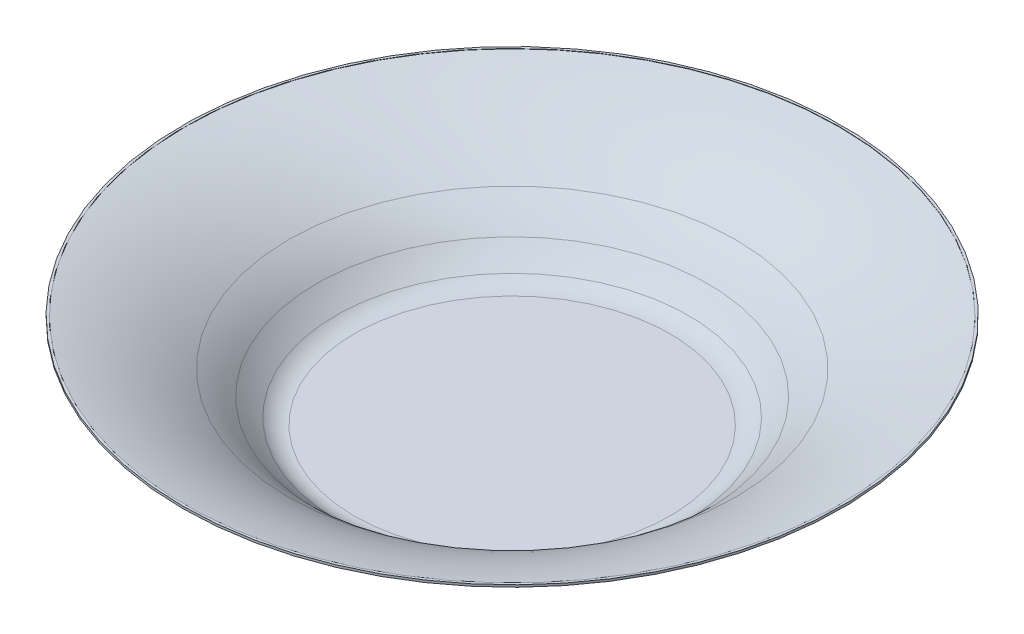
ISO-10303-21;
HEADER;
FILE_DESCRIPTION(('STEP AP214'),'2;1');
FILE_NAME('part.step','',(''),(''),'','','');
FILE_SCHEMA(('AUTOMOTIVE_DESIGN { 1 0 10303 214 1 1 1 1 }'));
ENDSEC;
DATA;
#1=APPLICATION_CONTEXT('core data for automotive mechanical design processes');
#2=APPLICATION_PROTOCOL_DEFINITION('international standard','automotive_design',2000,#1);
#3=PRODUCT_CONTEXT('',#1,'mechanical');
#4=PRODUCT('Part','Part','',(#3));
#5=PRODUCT_RELATED_PRODUCT_CATEGORY('part','',(#4));
#6=PRODUCT_DEFINITION_FORMATION('','',#4);
#7=PRODUCT_DEFINITION_CONTEXT('part definition',#1,'design');
#8=PRODUCT_DEFINITION('design','',#6,#7);
#9=PRODUCT_DEFINITION_SHAPE('','',#8);
#10=(LENGTH_UNIT() NAMED_UNIT(*) SI_UNIT(.MILLI.,.METRE.));
#11=(NAMED_UNIT(*) PLANE_ANGLE_UNIT() SI_UNIT($,.RADIAN.));
#12=(NAMED_UNIT(*) SI_UNIT($,.STERADIAN.) SOLID_ANGLE_UNIT());
#13=UNCERTAINTY_MEASURE_WITH_UNIT(LENGTH_MEASURE(1.E-05),#10,'distance_accuracy_value','');
#14=(GEOMETRIC_REPRESENTATION_CONTEXT(3) GLOBAL_UNCERTAINTY_ASSIGNED_CONTEXT((#13)) GLOBAL_UNIT_ASSIGNED_CONTEXT((#10,
#11,#12)) REPRESENTATION_CONTEXT('',''));
#15=CARTESIAN_POINT('',(0.,0.,0.));
#16=DIRECTION('',(0.,0.,1.));
#17=DIRECTION('',(1.,0.,0.));
#18=AXIS2_PLACEMENT_3D('',#15,#16,#17);
#19=CARTESIAN_POINT('',(0.,0.,0.));
#20=DIRECTION('',(0.,1.,0.));
#21=DIRECTION('',(0.,0.,1.));
#22=AXIS2_PLACEMENT_3D('',#19,#20,#21);
#23=PLANE('',#22);
#24=CARTESIAN_POINT('',(0.,0.,0.));
#25=DIRECTION('',(0.,1.,0.));
#26=DIRECTION('',(0.,0.,1.));
#27=AXIS2_PLACEMENT_3D('',#24,#25,#26);
#28=CIRCLE('',#27,70.1702740146846);
#29=CARTESIAN_POINT('',(0.,0.,70.1702740146846));
#30=VERTEX_POINT('',#29);
#31=EDGE_CURVE('E10',#30,#30,#28,.T.);
#32=ORIENTED_EDGE('',*,*,#31,.F.);
#33=EDGE_LOOP('',(#32));
#34=FACE_BOUND('',#33,.T.);
#35=ADVANCED_FACE('F39',(#34),#23,.F.);
#36=CARTESIAN_POINT('',(0.,13.961922493928,0.));
#37=DIRECTION('',(0.,1.,0.));
#38=DIRECTION('',(0.,0.,1.));
#39=AXIS2_PLACEMENT_3D('',#36,#37,#38);
#40=TOROIDAL_SURFACE('',#39,70.1702740146846,13.961922493928);
#41=CARTESIAN_POINT('',(0.,3.15994035202543,0.));
#42=DIRECTION('',(0.,1.,0.));
#43=DIRECTION('',(0.,0.,1.));
#44=AXIS2_PLACEMENT_3D('',#41,#42,#43);
#45=CIRCLE('',#44,79.0163161541089);
#46=CARTESIAN_POINT('',(0.,3.15994035202543,79.0163161541089));
#47=VERTEX_POINT('',#46);
#48=EDGE_CURVE('E45',#47,#47,#45,.T.);
#49=ORIENTED_EDGE('',*,*,#48,.F.);
#50=EDGE_LOOP('',(#49));
#51=FACE_BOUND('',#50,.T.);
#52=ORIENTED_EDGE('',*,*,#31,.T.);
#53=EDGE_LOOP('',(#52));
#54=FACE_BOUND('',#53,.T.);
#55=ADVANCED_FACE('F100',(#51,#54),#40,.T.);
#56=CARTESIAN_POINT('',(0.,69.6655676730446,0.));
#57=DIRECTION('',(0.,1.,0.));
#58=DIRECTION('',(0.,0.,1.));
#59=AXIS2_PLACEMENT_3D('',#56,#57,#58);
#60=DEGENERATE_TOROIDAL_SURFACE('',#59,24.553017283392,85.9607433032272,.T.);
#61=CARTESIAN_POINT('',(0.,11.2752552193501,0.));
#62=DIRECTION('',(0.,1.,0.));
#63=DIRECTION('',(0.,0.,1.));
#64=AXIS2_PLACEMENT_3D('',#61,#62,#63);
#65=CIRCLE('',#64,87.6388382006414);
#66=CARTESIAN_POINT('',(0.,11.2752552193501,87.6388382006414));
#67=VERTEX_POINT('',#66);
#68=EDGE_CURVE('E49',#67,#67,#65,.T.);
#69=ORIENTED_EDGE('',*,*,#68,.F.);
#70=EDGE_LOOP('',(#69));
#71=FACE_BOUND('',#70,.T.);
#72=ORIENTED_EDGE('',*,*,#48,.T.);
#73=EDGE_LOOP('',(#72));
#74=FACE_BOUND('',#73,.T.);
#75=ADVANCED_FACE('F105',(#71,#74),#60,.T.);
#76=CARTESIAN_POINT('',(0.,-41.0403301978101,0.));
#77=DIRECTION('',(0.,1.,0.));
#78=DIRECTION('',(0.,0.,1.));
#79=AXIS2_PLACEMENT_3D('',#76,#77,#78);
#80=TOROIDAL_SURFACE('',#79,144.161427550122,77.0176835818255);
#81=CARTESIAN_POINT('',(0.,21.9266059827138,0.));
#82=DIRECTION('',(0.,1.,0.));
#83=DIRECTION('',(0.,0.,1.));
#84=AXIS2_PLACEMENT_3D('',#81,#82,#83);
#85=CIRCLE('',#84,99.8118105016285);
#86=CARTESIAN_POINT('',(0.,21.9266059827138,99.8118105016285));
#87=VERTEX_POINT('',#86);
#88=EDGE_CURVE('E53',#87,#87,#85,.T.);
#89=ORIENTED_EDGE('',*,*,#88,.F.);
#90=EDGE_LOOP('',(#89));
#91=FACE_BOUND('',#90,.T.);
#92=ORIENTED_EDGE('',*,*,#68,.T.);
#93=EDGE_LOOP('',(#92));
#94=FACE_BOUND('',#93,.T.);
#95=ADVANCED_FACE('F110',(#91,#94),#80,.F.);
#96=CARTESIAN_POINT('',(0.,-79.5685426186936,0.));
#97=DIRECTION('',(0.,1.,0.));
#98=DIRECTION('',(0.,0.,1.));
#99=AXIS2_PLACEMENT_3D('',#96,#97,#98);
#100=TOROIDAL_SURFACE('',#99,171.298073702483,124.143268106022);
#101=CARTESIAN_POINT('',(0.,42.0676346604215,0.));
#102=DIRECTION('',(0.,1.,0.));
#103=DIRECTION('',(0.,0.,1.));
#104=AXIS2_PLACEMENT_3D('',#101,#102,#103);
#105=CIRCLE('',#104,146.474870988745);
#106=CARTESIAN_POINT('',(0.,42.0676346604215,146.474870988745));
#107=VERTEX_POINT('',#106);
#108=EDGE_CURVE('E58',#107,#107,#105,.T.);
#109=ORIENTED_EDGE('',*,*,#108,.F.);
#110=EDGE_LOOP('',(#109));
#111=FACE_BOUND('',#110,.T.);
#112=ORIENTED_EDGE('',*,*,#88,.T.);
#113=EDGE_LOOP('',(#112));
#114=FACE_BOUND('',#113,.T.);
#115=ADVANCED_FACE('F116',(#111,#114),#100,.F.);
#116=CARTESIAN_POINT('',(0.,43.0435740359115,0.));
#117=DIRECTION('',(0.,1.,0.));
#118=DIRECTION('',(0.,0.,1.));
#119=AXIS2_PLACEMENT_3D('',#116,#117,#118);
#120=CYLINDRICAL_SURFACE('',#119,146.474870988745);
#121=CARTESIAN_POINT('',(0.,43.0435740359115,0.));
#122=DIRECTION('',(0.,1.,0.));
#123=DIRECTION('',(0.,0.,1.));
#124=AXIS2_PLACEMENT_3D('',#121,#122,#123);
#125=CIRCLE('',#124,146.474870988745);
#126=CARTESIAN_POINT('',(0.,43.0435740359115,146.474870988745));
#127=VERTEX_POINT('',#126);
#128=EDGE_CURVE('E61',#127,#127,#125,.T.);
#129=ORIENTED_EDGE('',*,*,#128,.F.);
#130=EDGE_LOOP('',(#129));
#131=FACE_BOUND('',#130,.T.);
#132=ORIENTED_EDGE('',*,*,#108,.T.);
#133=EDGE_LOOP('',(#132));
#134=FACE_BOUND('',#133,.T.);
#135=ADVANCED_FACE('F120',(#131,#134),#120,.T.);
#136=CARTESIAN_POINT('',(146.474870988745,43.0435740359115,0.));
#137=DIRECTION('',(0.,-1.,0.));
#138=DIRECTION('',(0.,0.,-1.));
#139=AXIS2_PLACEMENT_3D('',#136,#137,#138);
#140=PLANE('',#139);
#141=CARTESIAN_POINT('',(0.,43.0435740359115,0.));
#142=DIRECTION('',(0.,-1.,0.));
#143=DIRECTION('',(0.,0.,-1.));
#144=AXIS2_PLACEMENT_3D('',#141,#142,#143);
#145=CIRCLE('',#144,145.474870988745);
#146=CARTESIAN_POINT('',(0.,43.0435740359115,-145.474870988745));
#147=VERTEX_POINT('',#146);
#148=EDGE_CURVE('E65',#147,#147,#145,.F.);
#149=ORIENTED_EDGE('',*,*,#148,.F.);
#150=EDGE_LOOP('',(#149));
#151=FACE_BOUND('',#150,.T.);
#152=ORIENTED_EDGE('',*,*,#128,.T.);
#153=EDGE_LOOP('',(#152));
#154=FACE_BOUND('',#153,.T.);
#155=ADVANCED_FACE('F97',(#151,#154),#140,.F.);
#156=CARTESIAN_POINT('',(0.,1.,0.));
#157=DIRECTION('',(0.,1.,0.));
#158=DIRECTION('',(0.,0.,1.));
#159=AXIS2_PLACEMENT_3D('',#156,#157,#158);
#160=PLANE('',#159);
#161=CARTESIAN_POINT('',(0.,1.,0.));
#162=DIRECTION('',(0.,1.,0.));
#163=DIRECTION('',(0.,0.,1.));
#164=AXIS2_PLACEMENT_3D('',#161,#162,#163);
#165=CIRCLE('',#164,70.1702740146846);
#166=CARTESIAN_POINT('',(0.,1.,70.1702740146846));
#167=VERTEX_POINT('',#166);
#168=EDGE_CURVE('E64',#167,#167,#165,.T.);
#169=ORIENTED_EDGE('',*,*,#168,.T.);
#170=EDGE_LOOP('',(#169));
#171=FACE_BOUND('',#170,.T.);
#172=ADVANCED_FACE('F83',(#171),#160,.T.);
#173=CARTESIAN_POINT('',(0.,13.961922493928,0.));
#174=DIRECTION('',(0.,1.,0.));
#175=DIRECTION('',(0.,0.,1.));
#176=AXIS2_PLACEMENT_3D('',#173,#174,#175);
#177=TOROIDAL_SURFACE('',#176,70.1702740146846,12.961922493928);
#178=CARTESIAN_POINT('',(0.,3.93361476159192,0.));
#179=DIRECTION('',(0.,1.,0.));
#180=DIRECTION('',(0.,0.,1.));
#181=AXIS2_PLACEMENT_3D('',#178,#179,#180);
#182=CIRCLE('',#181,78.382732767346);
#183=CARTESIAN_POINT('',(0.,3.93361476159192,78.382732767346));
#184=VERTEX_POINT('',#183);
#185=EDGE_CURVE('E77',#184,#184,#182,.T.);
#186=ORIENTED_EDGE('',*,*,#185,.T.);
#187=EDGE_LOOP('',(#186));
#188=FACE_BOUND('',#187,.T.);
#189=ORIENTED_EDGE('',*,*,#168,.F.);
#190=EDGE_LOOP('',(#189));
#191=FACE_BOUND('',#190,.T.);
#192=ADVANCED_FACE('F85',(#188,#191),#177,.F.);
#193=CARTESIAN_POINT('',(0.,69.6655676730446,0.));
#194=DIRECTION('',(0.,1.,0.));
#195=DIRECTION('',(0.,0.,1.));
#196=AXIS2_PLACEMENT_3D('',#193,#194,#195);
#197=DEGENERATE_TOROIDAL_SURFACE('',#196,24.553017283392,84.9607433032272,.T.);
#198=CARTESIAN_POINT('',(0.,11.9545224081844,0.));
#199=DIRECTION('',(0.,1.,0.));
#200=DIRECTION('',(0.,0.,1.));
#201=AXIS2_PLACEMENT_3D('',#198,#199,#200);
#202=CIRCLE('',#201,86.9049471418506);
#203=CARTESIAN_POINT('',(0.,11.9545224081844,86.9049471418506));
#204=VERTEX_POINT('',#203);
#205=EDGE_CURVE('E74',#204,#204,#202,.T.);
#206=ORIENTED_EDGE('',*,*,#205,.T.);
#207=EDGE_LOOP('',(#206));
#208=FACE_BOUND('',#207,.T.);
#209=ORIENTED_EDGE('',*,*,#185,.F.);
#210=EDGE_LOOP('',(#209));
#211=FACE_BOUND('',#210,.T.);
#212=ADVANCED_FACE('F87',(#208,#211),#197,.F.);
#213=CARTESIAN_POINT('',(0.,-41.0403301978101,0.));
#214=DIRECTION('',(0.,1.,0.));
#215=DIRECTION('',(0.,0.,1.));
#216=AXIS2_PLACEMENT_3D('',#213,#214,#215);
#217=TOROIDAL_SURFACE('',#216,144.161427550122,78.0176835818255);
#218=CARTESIAN_POINT('',(0.,22.7441706412721,0.));
#219=DIRECTION('',(0.,1.,0.));
#220=DIRECTION('',(0.,0.,1.));
#221=AXIS2_PLACEMENT_3D('',#218,#219,#220);
#222=CIRCLE('',#221,99.2359736939507);
#223=CARTESIAN_POINT('',(0.,22.7441706412721,99.2359736939507));
#224=VERTEX_POINT('',#223);
#225=EDGE_CURVE('E71',#224,#224,#222,.T.);
#226=ORIENTED_EDGE('',*,*,#225,.T.);
#227=EDGE_LOOP('',(#226));
#228=FACE_BOUND('',#227,.T.);
#229=ORIENTED_EDGE('',*,*,#205,.F.);
#230=EDGE_LOOP('',(#229));
#231=FACE_BOUND('',#230,.T.);
#232=ADVANCED_FACE('F94',(#228,#231),#217,.T.);
#233=CARTESIAN_POINT('',(0.,-79.5685426186936,0.));
#234=DIRECTION('',(0.,1.,0.));
#235=DIRECTION('',(0.,0.,1.));
#236=AXIS2_PLACEMENT_3D('',#233,#234,#235);
#237=TOROIDAL_SURFACE('',#236,171.298073702483,125.143268106022);
#238=CARTESIAN_POINT('',(0.,42.881446167998,0.));
#239=DIRECTION('',(0.,-1.,0.));
#240=DIRECTION('',(0.,0.,-1.));
#241=AXIS2_PLACEMENT_3D('',#238,#239,#240);
#242=CIRCLE('',#241,145.474870988745);
#243=CARTESIAN_POINT('',(0.,42.881446167998,-145.474870988745));
#244=VERTEX_POINT('',#243);
#245=EDGE_CURVE('E68',#244,#244,#242,.F.);
#246=ORIENTED_EDGE('',*,*,#245,.T.);
#247=EDGE_LOOP('',(#246));
#248=FACE_BOUND('',#247,.T.);
#249=ORIENTED_EDGE('',*,*,#225,.F.);
#250=EDGE_LOOP('',(#249));
#251=FACE_BOUND('',#250,.T.);
#252=ADVANCED_FACE('F131',(#248,#251),#237,.T.);
#253=CARTESIAN_POINT('',(0.,43.0435740359115,0.));
#254=DIRECTION('',(0.,1.,0.));
#255=DIRECTION('',(0.,0.,1.));
#256=AXIS2_PLACEMENT_3D('',#253,#254,#255);
#257=CYLINDRICAL_SURFACE('',#256,145.474870988745);
#258=ORIENTED_EDGE('',*,*,#148,.T.);
#259=EDGE_LOOP('',(#258));
#260=FACE_BOUND('',#259,.T.);
#261=ORIENTED_EDGE('',*,*,#245,.F.);
#262=EDGE_LOOP('',(#261));
#263=FACE_BOUND('',#262,.T.);
#264=ADVANCED_FACE('F128',(#260,#263),#257,.F.);
#265=CLOSED_SHELL('',(#35,#55,#75,#95,#115,#135,#155,#172,#192,#212,#232,#252,#264));
#266=MANIFOLD_SOLID_BREP('B2',#265);
#267=ADVANCED_BREP_SHAPE_REPRESENTATION('',(#18,#266),#14);
#268=SHAPE_DEFINITION_REPRESENTATION(#9,#267);
ENDSEC;
END-ISO-10303-21;
